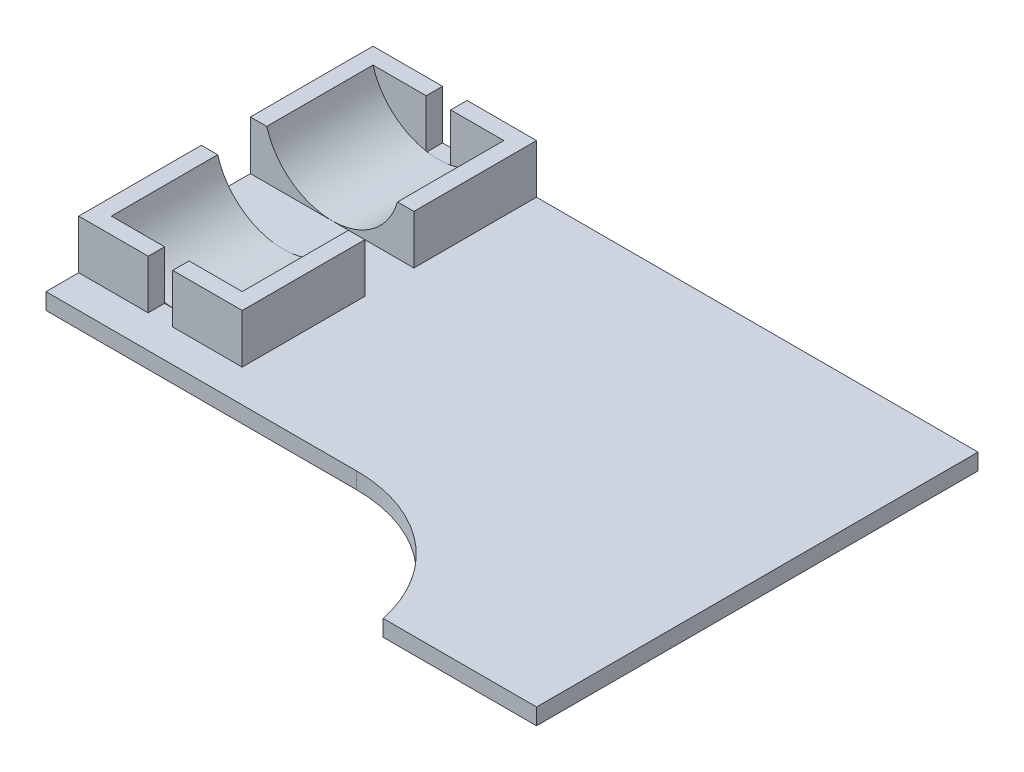
ISO-10303-21;
HEADER;
FILE_DESCRIPTION(('STEP AP214'),'2;1');
FILE_NAME('part.step','',(''),(''),'','','');
FILE_SCHEMA(('AUTOMOTIVE_DESIGN { 1 0 10303 214 1 1 1 1 }'));
ENDSEC;
DATA;
#1=APPLICATION_CONTEXT('core data for automotive mechanical design processes');
#2=APPLICATION_PROTOCOL_DEFINITION('international standard','automotive_design',2000,#1);
#3=PRODUCT_CONTEXT('',#1,'mechanical');
#4=PRODUCT('Part','Part','',(#3));
#5=PRODUCT_RELATED_PRODUCT_CATEGORY('part','',(#4));
#6=PRODUCT_DEFINITION_FORMATION('','',#4);
#7=PRODUCT_DEFINITION_CONTEXT('part definition',#1,'design');
#8=PRODUCT_DEFINITION('design','',#6,#7);
#9=PRODUCT_DEFINITION_SHAPE('','',#8);
#10=(LENGTH_UNIT() NAMED_UNIT(*) SI_UNIT(.MILLI.,.METRE.));
#11=(NAMED_UNIT(*) PLANE_ANGLE_UNIT() SI_UNIT($,.RADIAN.));
#12=(NAMED_UNIT(*) SI_UNIT($,.STERADIAN.) SOLID_ANGLE_UNIT());
#13=UNCERTAINTY_MEASURE_WITH_UNIT(LENGTH_MEASURE(1.E-05),#10,'distance_accuracy_value','');
#14=(GEOMETRIC_REPRESENTATION_CONTEXT(3) GLOBAL_UNCERTAINTY_ASSIGNED_CONTEXT((#13)) GLOBAL_UNIT_ASSIGNED_CONTEXT((#10,
#11,#12)) REPRESENTATION_CONTEXT('',''));
#15=CARTESIAN_POINT('',(0.,0.,0.));
#16=DIRECTION('',(0.,0.,1.));
#17=DIRECTION('',(1.,0.,0.));
#18=AXIS2_PLACEMENT_3D('',#15,#16,#17);
#19=CARTESIAN_POINT('',(-135.,51.6666666666667,85.));
#20=DIRECTION('',(0.,0.,-1.));
#21=DIRECTION('',(-1.,0.,0.));
#22=AXIS2_PLACEMENT_3D('',#19,#20,#21);
#23=CYLINDRICAL_SURFACE('',#22,41.6666666666667);
#24=CARTESIAN_POINT('',(-135.,51.6666666666667,-30.));
#25=DIRECTION('',(0.,0.,1.));
#26=DIRECTION('',(1.,0.,0.));
#27=AXIS2_PLACEMENT_3D('',#24,#25,#26);
#28=CIRCLE('',#27,41.6666666666667);
#29=CARTESIAN_POINT('',(-175.,40.,-30.));
#30=VERTEX_POINT('',#29);
#31=CARTESIAN_POINT('',(-135.,10.,-30.));
#32=VERTEX_POINT('',#31);
#33=EDGE_CURVE('E267',#30,#32,#28,.T.);
#34=ORIENTED_EDGE('',*,*,#33,.F.);
#35=DIRECTION('',(0.,0.,-1.));
#36=VECTOR('',#35,1.);
#37=CARTESIAN_POINT('',(-175.,40.,35.));
#38=LINE('',#37,#36);
#39=CARTESIAN_POINT('',(-175.,40.,35.));
#40=VERTEX_POINT('',#39);
#41=EDGE_CURVE('E359',#40,#30,#38,.T.);
#42=ORIENTED_EDGE('',*,*,#41,.F.);
#43=CARTESIAN_POINT('',(-135.,51.6666666666667,35.));
#44=DIRECTION('',(0.,0.,1.));
#45=DIRECTION('',(1.,0.,0.));
#46=AXIS2_PLACEMENT_3D('',#43,#44,#45);
#47=CIRCLE('',#46,41.6666666666667);
#48=CARTESIAN_POINT('',(-142.5,10.6805579088069,35.));
#49=VERTEX_POINT('',#48);
#50=EDGE_CURVE('E523',#40,#49,#47,.T.);
#51=ORIENTED_EDGE('',*,*,#50,.T.);
#52=CARTESIAN_POINT('',(-135.,10.,35.));
#53=VERTEX_POINT('',#52);
#54=EDGE_CURVE('E520',#49,#53,#47,.T.);
#55=ORIENTED_EDGE('',*,*,#54,.T.);
#56=CARTESIAN_POINT('',(-135.,51.6666666666667,35.));
#57=DIRECTION('',(0.,0.,1.));
#58=DIRECTION('',(1.,0.,0.));
#59=AXIS2_PLACEMENT_3D('',#56,#57,#58);
#60=CIRCLE('',#59,41.6666666666667);
#61=CARTESIAN_POINT('',(-127.5,10.6805579088069,35.));
#62=VERTEX_POINT('',#61);
#63=EDGE_CURVE('E551',#53,#62,#60,.T.);
#64=ORIENTED_EDGE('',*,*,#63,.T.);
#65=CARTESIAN_POINT('',(-95.,40.,35.));
#66=VERTEX_POINT('',#65);
#67=EDGE_CURVE('E545',#62,#66,#60,.T.);
#68=ORIENTED_EDGE('',*,*,#67,.T.);
#69=DIRECTION('',(0.,0.,1.));
#70=VECTOR('',#69,1.);
#71=CARTESIAN_POINT('',(-95.,40.,35.));
#72=LINE('',#71,#70);
#73=CARTESIAN_POINT('',(-95.,40.,-30.));
#74=VERTEX_POINT('',#73);
#75=EDGE_CURVE('E515',#74,#66,#72,.T.);
#76=ORIENTED_EDGE('',*,*,#75,.F.);
#77=EDGE_CURVE('E511',#32,#74,#28,.T.);
#78=ORIENTED_EDGE('',*,*,#77,.F.);
#79=EDGE_LOOP('',(#34,#42,#51,#55,#64,#68,#76,#78));
#80=FACE_BOUND('',#79,.T.);
#81=ADVANCED_FACE('F61',(#80),#23,.F.);
#82=CARTESIAN_POINT('',(5.00000000000003,10.,153.052821927466));
#83=DIRECTION('',(0.,-1.,0.));
#84=DIRECTION('',(0.,0.,-1.));
#85=AXIS2_PLACEMENT_3D('',#82,#83,#84);
#86=PLANE('',#85);
#87=DIRECTION('',(1.,0.,0.));
#88=VECTOR('',#87,1.);
#89=CARTESIAN_POINT('',(0.,10.,-125.));
#90=LINE('',#89,#88);
#91=CARTESIAN_POINT('',(-142.5,10.,-125.));
#92=VERTEX_POINT('',#91);
#93=CARTESIAN_POINT('',(-135.,10.,-125.));
#94=VERTEX_POINT('',#93);
#95=EDGE_CURVE('E532',#92,#94,#90,.T.);
#96=ORIENTED_EDGE('',*,*,#95,.T.);
#97=DIRECTION('',(1.,0.,0.));
#98=VECTOR('',#97,1.);
#99=CARTESIAN_POINT('',(0.,10.,-125.));
#100=LINE('',#99,#98);
#101=CARTESIAN_POINT('',(-127.5,10.,-125.));
#102=VERTEX_POINT('',#101);
#103=EDGE_CURVE('E546',#94,#102,#100,.T.);
#104=ORIENTED_EDGE('',*,*,#103,.T.);
#105=DIRECTION('',(0.,0.,1.));
#106=VECTOR('',#105,1.);
#107=CARTESIAN_POINT('',(-127.5,10.,-135.));
#108=LINE('',#107,#106);
#109=CARTESIAN_POINT('',(-127.5,10.,-135.));
#110=VERTEX_POINT('',#109);
#111=EDGE_CURVE('E294',#110,#102,#108,.T.);
#112=ORIENTED_EDGE('',*,*,#111,.F.);
#113=DIRECTION('',(-1.,0.,0.));
#114=VECTOR('',#113,1.);
#115=CARTESIAN_POINT('',(-185.,10.,-135.));
#116=LINE('',#115,#114);
#117=CARTESIAN_POINT('',(-142.5,10.,-135.));
#118=VERTEX_POINT('',#117);
#119=EDGE_CURVE('E417',#110,#118,#116,.T.);
#120=ORIENTED_EDGE('',*,*,#119,.T.);
#121=DIRECTION('',(0.,0.,-1.));
#122=VECTOR('',#121,1.);
#123=CARTESIAN_POINT('',(-142.5,10.,-135.));
#124=LINE('',#123,#122);
#125=EDGE_CURVE('E314',#92,#118,#124,.T.);
#126=ORIENTED_EDGE('',*,*,#125,.F.);
#127=EDGE_LOOP('',(#96,#104,#112,#120,#126));
#128=FACE_BOUND('',#127,.T.);
#129=ADVANCED_FACE('F639',(#128),#86,.F.);
#130=DIRECTION('',(0.,0.,-1.));
#131=VECTOR('',#130,1.);
#132=CARTESIAN_POINT('',(-85.,10.,-60.));
#133=LINE('',#132,#131);
#134=CARTESIAN_POINT('',(-85.,10.,-60.));
#135=VERTEX_POINT('',#134);
#136=CARTESIAN_POINT('',(-85.,10.,-135.));
#137=VERTEX_POINT('',#136);
#138=EDGE_CURVE('E290',#135,#137,#133,.T.);
#139=ORIENTED_EDGE('',*,*,#138,.F.);
#140=DIRECTION('',(1.,0.,0.));
#141=VECTOR('',#140,1.);
#142=CARTESIAN_POINT('',(-95.,10.,-60.));
#143=LINE('',#142,#141);
#144=CARTESIAN_POINT('',(-135.,10.,-60.));
#145=VERTEX_POINT('',#144);
#146=EDGE_CURVE('E299',#145,#135,#143,.T.);
#147=ORIENTED_EDGE('',*,*,#146,.F.);
#148=DIRECTION('',(1.,0.,0.));
#149=VECTOR('',#148,1.);
#150=CARTESIAN_POINT('',(-175.,10.,-60.));
#151=LINE('',#150,#149);
#152=CARTESIAN_POINT('',(-185.,10.,-60.));
#153=VERTEX_POINT('',#152);
#154=EDGE_CURVE('E320',#153,#145,#151,.T.);
#155=ORIENTED_EDGE('',*,*,#154,.F.);
#156=DIRECTION('',(0.,0.,1.));
#157=VECTOR('',#156,1.);
#158=CARTESIAN_POINT('',(-185.,10.,-135.));
#159=LINE('',#158,#157);
#160=CARTESIAN_POINT('',(-185.,10.,-30.));
#161=VERTEX_POINT('',#160);
#162=EDGE_CURVE('E401',#153,#161,#159,.T.);
#163=ORIENTED_EDGE('',*,*,#162,.T.);
#164=DIRECTION('',(-1.,0.,0.));
#165=VECTOR('',#164,1.);
#166=CARTESIAN_POINT('',(-175.,10.,-30.));
#167=LINE('',#166,#165);
#168=EDGE_CURVE('E354',#32,#161,#167,.T.);
#169=ORIENTED_EDGE('',*,*,#168,.F.);
#170=DIRECTION('',(-1.,0.,0.));
#171=VECTOR('',#170,1.);
#172=CARTESIAN_POINT('',(-95.,10.,-30.));
#173=LINE('',#172,#171);
#174=CARTESIAN_POINT('',(-85.,10.,-30.));
#175=VERTEX_POINT('',#174);
#176=EDGE_CURVE('E597',#175,#32,#173,.T.);
#177=ORIENTED_EDGE('',*,*,#176,.F.);
#178=DIRECTION('',(0.,0.,-1.));
#179=VECTOR('',#178,1.);
#180=CARTESIAN_POINT('',(-85.,10.,45.));
#181=LINE('',#180,#179);
#182=CARTESIAN_POINT('',(-85.,10.,45.));
#183=VERTEX_POINT('',#182);
#184=EDGE_CURVE('E593',#183,#175,#181,.T.);
#185=ORIENTED_EDGE('',*,*,#184,.F.);
#186=DIRECTION('',(1.,0.,0.));
#187=VECTOR('',#186,1.);
#188=CARTESIAN_POINT('',(-127.5,10.,45.));
#189=LINE('',#188,#187);
#190=CARTESIAN_POINT('',(-127.5,10.,45.));
#191=VERTEX_POINT('',#190);
#192=EDGE_CURVE('E569',#191,#183,#189,.T.);
#193=ORIENTED_EDGE('',*,*,#192,.F.);
#194=DIRECTION('',(0.,0.,1.));
#195=VECTOR('',#194,1.);
#196=CARTESIAN_POINT('',(-127.5,10.,45.));
#197=LINE('',#196,#195);
#198=CARTESIAN_POINT('',(-127.5,10.,35.));
#199=VERTEX_POINT('',#198);
#200=EDGE_CURVE('E575',#199,#191,#197,.T.);
#201=ORIENTED_EDGE('',*,*,#200,.F.);
#202=DIRECTION('',(1.,0.,0.));
#203=VECTOR('',#202,1.);
#204=CARTESIAN_POINT('',(0.,10.,35.));
#205=LINE('',#204,#203);
#206=EDGE_CURVE('E556',#53,#199,#205,.T.);
#207=ORIENTED_EDGE('',*,*,#206,.F.);
#208=DIRECTION('',(1.,0.,0.));
#209=VECTOR('',#208,1.);
#210=CARTESIAN_POINT('',(0.,10.,35.));
#211=LINE('',#210,#209);
#212=CARTESIAN_POINT('',(-142.5,10.,35.));
#213=VERTEX_POINT('',#212);
#214=EDGE_CURVE('E526',#213,#53,#211,.T.);
#215=ORIENTED_EDGE('',*,*,#214,.F.);
#216=DIRECTION('',(0.,0.,-1.));
#217=VECTOR('',#216,1.);
#218=CARTESIAN_POINT('',(-142.5,10.,45.));
#219=LINE('',#218,#217);
#220=CARTESIAN_POINT('',(-142.5,10.,45.));
#221=VERTEX_POINT('',#220);
#222=EDGE_CURVE('E360',#221,#213,#219,.T.);
#223=ORIENTED_EDGE('',*,*,#222,.F.);
#224=DIRECTION('',(1.,0.,0.));
#225=VECTOR('',#224,1.);
#226=CARTESIAN_POINT('',(-185.,10.,45.));
#227=LINE('',#226,#225);
#228=CARTESIAN_POINT('',(-185.,10.,45.));
#229=VERTEX_POINT('',#228);
#230=EDGE_CURVE('E380',#229,#221,#227,.T.);
#231=ORIENTED_EDGE('',*,*,#230,.F.);
#232=CARTESIAN_POINT('',(-185.,10.,65.));
#233=VERTEX_POINT('',#232);
#234=EDGE_CURVE('E405',#229,#233,#159,.T.);
#235=ORIENTED_EDGE('',*,*,#234,.T.);
#236=DIRECTION('',(1.,0.,0.));
#237=VECTOR('',#236,1.);
#238=CARTESIAN_POINT('',(-185.,10.,65.));
#239=LINE('',#238,#237);
#240=CARTESIAN_POINT('',(5.00000000000003,10.,65.));
#241=VERTEX_POINT('',#240);
#242=EDGE_CURVE('E404',#233,#241,#239,.T.);
#243=ORIENTED_EDGE('',*,*,#242,.T.);
#244=CARTESIAN_POINT('',(5.00000000000003,10.,153.052821927466));
#245=DIRECTION('',(0.,-1.,0.));
#246=DIRECTION('',(0.,0.,-1.));
#247=AXIS2_PLACEMENT_3D('',#244,#245,#246);
#248=CIRCLE('',#247,88.0528219274657);
#249=CARTESIAN_POINT('',(91.1823361823362,10.,135.));
#250=VERTEX_POINT('',#249);
#251=EDGE_CURVE('E408',#241,#250,#248,.T.);
#252=ORIENTED_EDGE('',*,*,#251,.T.);
#253=DIRECTION('',(1.,0.,0.));
#254=VECTOR('',#253,1.);
#255=CARTESIAN_POINT('',(91.1823361823362,10.,135.));
#256=LINE('',#255,#254);
#257=CARTESIAN_POINT('',(185.,10.,135.));
#258=VERTEX_POINT('',#257);
#259=EDGE_CURVE('E411',#250,#258,#256,.T.);
#260=ORIENTED_EDGE('',*,*,#259,.T.);
#261=DIRECTION('',(0.,0.,-1.));
#262=VECTOR('',#261,1.);
#263=CARTESIAN_POINT('',(185.,10.,-135.));
#264=LINE('',#263,#262);
#265=CARTESIAN_POINT('',(185.,10.,-135.));
#266=VERTEX_POINT('',#265);
#267=EDGE_CURVE('E414',#258,#266,#264,.T.);
#268=ORIENTED_EDGE('',*,*,#267,.T.);
#269=EDGE_CURVE('E418',#266,#137,#116,.T.);
#270=ORIENTED_EDGE('',*,*,#269,.T.);
#271=EDGE_LOOP('',(#139,#147,#155,#163,#169,#177,#185,#193,#201,#207,#215,#223,#231,#235,#243,
#252,#260,#268,#270));
#272=FACE_BOUND('',#271,.T.);
#273=ADVANCED_FACE('F480',(#272),#86,.F.);
#274=CARTESIAN_POINT('',(-185.,10.,-135.));
#275=DIRECTION('',(1.,0.,0.));
#276=DIRECTION('',(0.,0.,-1.));
#277=AXIS2_PLACEMENT_3D('',#274,#275,#276);
#278=PLANE('',#277);
#279=DIRECTION('',(0.,0.,1.));
#280=VECTOR('',#279,1.);
#281=CARTESIAN_POINT('',(-185.,0.,-135.));
#282=LINE('',#281,#280);
#283=CARTESIAN_POINT('',(-185.,0.,-135.));
#284=VERTEX_POINT('',#283);
#285=CARTESIAN_POINT('',(-185.,0.,65.));
#286=VERTEX_POINT('',#285);
#287=EDGE_CURVE('E400',#284,#286,#282,.T.);
#288=ORIENTED_EDGE('',*,*,#287,.T.);
#289=DIRECTION('',(0.,-1.,0.));
#290=VECTOR('',#289,1.);
#291=CARTESIAN_POINT('',(-185.,10.,65.));
#292=LINE('',#291,#290);
#293=EDGE_CURVE('E12',#233,#286,#292,.T.);
#294=ORIENTED_EDGE('',*,*,#293,.F.);
#295=ORIENTED_EDGE('',*,*,#234,.F.);
#296=DIRECTION('',(0.,-1.,0.));
#297=VECTOR('',#296,1.);
#298=CARTESIAN_POINT('',(-185.,40.,45.));
#299=LINE('',#298,#297);
#300=CARTESIAN_POINT('',(-185.,40.,45.));
#301=VERTEX_POINT('',#300);
#302=EDGE_CURVE('E392',#301,#229,#299,.T.);
#303=ORIENTED_EDGE('',*,*,#302,.F.);
#304=DIRECTION('',(0.,0.,1.));
#305=VECTOR('',#304,1.);
#306=CARTESIAN_POINT('',(-185.,40.,45.));
#307=LINE('',#306,#305);
#308=CARTESIAN_POINT('',(-185.,40.,-30.));
#309=VERTEX_POINT('',#308);
#310=EDGE_CURVE('E367',#309,#301,#307,.T.);
#311=ORIENTED_EDGE('',*,*,#310,.F.);
#312=DIRECTION('',(0.,-1.,0.));
#313=VECTOR('',#312,1.);
#314=CARTESIAN_POINT('',(-185.,40.,-30.));
#315=LINE('',#314,#313);
#316=EDGE_CURVE('E396',#309,#161,#315,.T.);
#317=ORIENTED_EDGE('',*,*,#316,.T.);
#318=ORIENTED_EDGE('',*,*,#162,.F.);
#319=DIRECTION('',(0.,-1.,0.));
#320=VECTOR('',#319,1.);
#321=CARTESIAN_POINT('',(-185.,40.,-60.));
#322=LINE('',#321,#320);
#323=CARTESIAN_POINT('',(-185.,40.,-60.));
#324=VERTEX_POINT('',#323);
#325=EDGE_CURVE('E337',#324,#153,#322,.T.);
#326=ORIENTED_EDGE('',*,*,#325,.F.);
#327=DIRECTION('',(0.,0.,1.));
#328=VECTOR('',#327,1.);
#329=CARTESIAN_POINT('',(-185.,40.,-60.));
#330=LINE('',#329,#328);
#331=CARTESIAN_POINT('',(-185.,40.,-135.));
#332=VERTEX_POINT('',#331);
#333=EDGE_CURVE('E330',#332,#324,#330,.T.);
#334=ORIENTED_EDGE('',*,*,#333,.F.);
#335=DIRECTION('',(0.,-1.,0.));
#336=VECTOR('',#335,1.);
#337=CARTESIAN_POINT('',(-185.,10.,-135.));
#338=LINE('',#337,#336);
#339=EDGE_CURVE('E421',#332,#284,#338,.T.);
#340=ORIENTED_EDGE('',*,*,#339,.T.);
#341=EDGE_LOOP('',(#288,#294,#295,#303,#311,#317,#318,#326,#334,#340));
#342=FACE_BOUND('',#341,.T.);
#343=ADVANCED_FACE('F63',(#342),#278,.F.);
#344=CARTESIAN_POINT('',(-185.,10.,65.));
#345=DIRECTION('',(0.,0.,-1.));
#346=DIRECTION('',(-1.,0.,0.));
#347=AXIS2_PLACEMENT_3D('',#344,#345,#346);
#348=PLANE('',#347);
#349=DIRECTION('',(1.,0.,0.));
#350=VECTOR('',#349,1.);
#351=CARTESIAN_POINT('',(-185.,0.,65.));
#352=LINE('',#351,#350);
#353=CARTESIAN_POINT('',(5.00000000000003,0.,65.));
#354=VERTEX_POINT('',#353);
#355=EDGE_CURVE('E425',#286,#354,#352,.T.);
#356=ORIENTED_EDGE('',*,*,#355,.T.);
#357=DIRECTION('',(0.,-1.,0.));
#358=VECTOR('',#357,1.);
#359=CARTESIAN_POINT('',(5.00000000000003,10.,65.));
#360=LINE('',#359,#358);
#361=EDGE_CURVE('E70',#241,#354,#360,.T.);
#362=ORIENTED_EDGE('',*,*,#361,.F.);
#363=ORIENTED_EDGE('',*,*,#242,.F.);
#364=ORIENTED_EDGE('',*,*,#293,.T.);
#365=EDGE_LOOP('',(#356,#362,#363,#364));
#366=FACE_BOUND('',#365,.T.);
#367=ADVANCED_FACE('F483',(#366),#348,.F.);
#368=CARTESIAN_POINT('',(5.00000000000003,10.,153.052821927466));
#369=DIRECTION('',(0.,-1.,0.));
#370=DIRECTION('',(0.,0.,-1.));
#371=AXIS2_PLACEMENT_3D('',#368,#369,#370);
#372=CYLINDRICAL_SURFACE('',#371,88.0528219274657);
#373=CARTESIAN_POINT('',(5.00000000000003,0.,153.052821927466));
#374=DIRECTION('',(0.,-1.,0.));
#375=DIRECTION('',(0.,0.,-1.));
#376=AXIS2_PLACEMENT_3D('',#373,#374,#375);
#377=CIRCLE('',#376,88.0528219274657);
#378=CARTESIAN_POINT('',(91.1823361823362,0.,135.));
#379=VERTEX_POINT('',#378);
#380=EDGE_CURVE('E428',#354,#379,#377,.T.);
#381=ORIENTED_EDGE('',*,*,#380,.T.);
#382=DIRECTION('',(0.,-1.,0.));
#383=VECTOR('',#382,1.);
#384=CARTESIAN_POINT('',(91.1823361823362,10.,135.));
#385=LINE('',#384,#383);
#386=EDGE_CURVE('E451',#250,#379,#385,.T.);
#387=ORIENTED_EDGE('',*,*,#386,.F.);
#388=ORIENTED_EDGE('',*,*,#251,.F.);
#389=ORIENTED_EDGE('',*,*,#361,.T.);
#390=EDGE_LOOP('',(#381,#387,#388,#389));
#391=FACE_BOUND('',#390,.T.);
#392=ADVANCED_FACE('F460',(#391),#372,.F.);
#393=CARTESIAN_POINT('',(91.1823361823362,10.,135.));
#394=DIRECTION('',(0.,0.,-1.));
#395=DIRECTION('',(-1.,0.,0.));
#396=AXIS2_PLACEMENT_3D('',#393,#394,#395);
#397=PLANE('',#396);
#398=DIRECTION('',(1.,0.,0.));
#399=VECTOR('',#398,1.);
#400=CARTESIAN_POINT('',(91.1823361823362,0.,135.));
#401=LINE('',#400,#399);
#402=CARTESIAN_POINT('',(185.,0.,135.));
#403=VERTEX_POINT('',#402);
#404=EDGE_CURVE('E431',#379,#403,#401,.T.);
#405=ORIENTED_EDGE('',*,*,#404,.T.);
#406=DIRECTION('',(0.,-1.,0.));
#407=VECTOR('',#406,1.);
#408=CARTESIAN_POINT('',(185.,10.,135.));
#409=LINE('',#408,#407);
#410=EDGE_CURVE('E447',#258,#403,#409,.T.);
#411=ORIENTED_EDGE('',*,*,#410,.F.);
#412=ORIENTED_EDGE('',*,*,#259,.F.);
#413=ORIENTED_EDGE('',*,*,#386,.T.);
#414=EDGE_LOOP('',(#405,#411,#412,#413));
#415=FACE_BOUND('',#414,.T.);
#416=ADVANCED_FACE('F472',(#415),#397,.F.);
#417=CARTESIAN_POINT('',(185.,10.,-135.));
#418=DIRECTION('',(-1.,0.,0.));
#419=DIRECTION('',(0.,0.,1.));
#420=AXIS2_PLACEMENT_3D('',#417,#418,#419);
#421=PLANE('',#420);
#422=DIRECTION('',(0.,0.,-1.));
#423=VECTOR('',#422,1.);
#424=CARTESIAN_POINT('',(185.,0.,-135.));
#425=LINE('',#424,#423);
#426=CARTESIAN_POINT('',(185.,0.,-135.));
#427=VERTEX_POINT('',#426);
#428=EDGE_CURVE('E434',#403,#427,#425,.T.);
#429=ORIENTED_EDGE('',*,*,#428,.T.);
#430=DIRECTION('',(0.,-1.,0.));
#431=VECTOR('',#430,1.);
#432=CARTESIAN_POINT('',(185.,10.,-135.));
#433=LINE('',#432,#431);
#434=EDGE_CURVE('E443',#266,#427,#433,.T.);
#435=ORIENTED_EDGE('',*,*,#434,.F.);
#436=ORIENTED_EDGE('',*,*,#267,.F.);
#437=ORIENTED_EDGE('',*,*,#410,.T.);
#438=EDGE_LOOP('',(#429,#435,#436,#437));
#439=FACE_BOUND('',#438,.T.);
#440=ADVANCED_FACE('F476',(#439),#421,.F.);
#441=CARTESIAN_POINT('',(-185.,10.,-135.));
#442=DIRECTION('',(0.,0.,1.));
#443=DIRECTION('',(1.,0.,0.));
#444=AXIS2_PLACEMENT_3D('',#441,#442,#443);
#445=PLANE('',#444);
#446=DIRECTION('',(-1.,0.,0.));
#447=VECTOR('',#446,1.);
#448=CARTESIAN_POINT('',(-185.,0.,-135.));
#449=LINE('',#448,#447);
#450=EDGE_CURVE('E437',#427,#284,#449,.T.);
#451=ORIENTED_EDGE('',*,*,#450,.T.);
#452=ORIENTED_EDGE('',*,*,#339,.F.);
#453=DIRECTION('',(-1.,0.,0.));
#454=VECTOR('',#453,1.);
#455=CARTESIAN_POINT('',(-185.,40.,-135.));
#456=LINE('',#455,#454);
#457=CARTESIAN_POINT('',(-142.5,40.,-135.));
#458=VERTEX_POINT('',#457);
#459=EDGE_CURVE('E326',#458,#332,#456,.T.);
#460=ORIENTED_EDGE('',*,*,#459,.F.);
#461=DIRECTION('',(0.,-1.,0.));
#462=VECTOR('',#461,1.);
#463=CARTESIAN_POINT('',(-142.5,40.,-135.));
#464=LINE('',#463,#462);
#465=EDGE_CURVE('E347',#458,#118,#464,.T.);
#466=ORIENTED_EDGE('',*,*,#465,.T.);
#467=ORIENTED_EDGE('',*,*,#119,.F.);
#468=DIRECTION('',(0.,-1.,0.));
#469=VECTOR('',#468,1.);
#470=CARTESIAN_POINT('',(-127.5,40.,-135.));
#471=LINE('',#470,#469);
#472=CARTESIAN_POINT('',(-127.5,40.,-135.));
#473=VERTEX_POINT('',#472);
#474=EDGE_CURVE('E306',#473,#110,#471,.T.);
#475=ORIENTED_EDGE('',*,*,#474,.F.);
#476=DIRECTION('',(-1.,0.,0.));
#477=VECTOR('',#476,1.);
#478=CARTESIAN_POINT('',(-127.5,40.,-135.));
#479=LINE('',#478,#477);
#480=CARTESIAN_POINT('',(-85.,40.,-135.));
#481=VERTEX_POINT('',#480);
#482=EDGE_CURVE('E492',#481,#473,#479,.T.);
#483=ORIENTED_EDGE('',*,*,#482,.F.);
#484=DIRECTION('',(0.,-1.,0.));
#485=VECTOR('',#484,1.);
#486=CARTESIAN_POINT('',(-85.,40.,-135.));
#487=LINE('',#486,#485);
#488=EDGE_CURVE('E310',#481,#137,#487,.T.);
#489=ORIENTED_EDGE('',*,*,#488,.T.);
#490=ORIENTED_EDGE('',*,*,#269,.F.);
#491=ORIENTED_EDGE('',*,*,#434,.T.);
#492=EDGE_LOOP('',(#451,#452,#460,#466,#467,#475,#483,#489,#490,#491));
#493=FACE_BOUND('',#492,.T.);
#494=ADVANCED_FACE('F488',(#493),#445,.F.);
#495=CARTESIAN_POINT('',(5.00000000000003,0.,153.052821927466));
#496=DIRECTION('',(0.,-1.,0.));
#497=DIRECTION('',(0.,0.,-1.));
#498=AXIS2_PLACEMENT_3D('',#495,#496,#497);
#499=PLANE('',#498);
#500=ORIENTED_EDGE('',*,*,#287,.F.);
#501=ORIENTED_EDGE('',*,*,#450,.F.);
#502=ORIENTED_EDGE('',*,*,#428,.F.);
#503=ORIENTED_EDGE('',*,*,#404,.F.);
#504=ORIENTED_EDGE('',*,*,#380,.F.);
#505=ORIENTED_EDGE('',*,*,#355,.F.);
#506=EDGE_LOOP('',(#500,#501,#502,#503,#504,#505));
#507=FACE_BOUND('',#506,.T.);
#508=ADVANCED_FACE('F467',(#507),#499,.T.);
#509=CARTESIAN_POINT('',(-175.,40.,35.));
#510=DIRECTION('',(0.,0.,1.));
#511=DIRECTION('',(1.,0.,0.));
#512=AXIS2_PLACEMENT_3D('',#509,#510,#511);
#513=PLANE('',#512);
#514=DIRECTION('',(0.,-1.,0.));
#515=VECTOR('',#514,1.);
#516=CARTESIAN_POINT('',(-142.5,40.,35.));
#517=LINE('',#516,#515);
#518=CARTESIAN_POINT('',(-142.5,40.,35.));
#519=VERTEX_POINT('',#518);
#520=EDGE_CURVE('E376',#519,#49,#517,.T.);
#521=ORIENTED_EDGE('',*,*,#520,.T.);
#522=ORIENTED_EDGE('',*,*,#50,.F.);
#523=DIRECTION('',(-1.,0.,0.));
#524=VECTOR('',#523,1.);
#525=CARTESIAN_POINT('',(-175.,40.,35.));
#526=LINE('',#525,#524);
#527=EDGE_CURVE('E355',#519,#40,#526,.T.);
#528=ORIENTED_EDGE('',*,*,#527,.F.);
#529=EDGE_LOOP('',(#521,#522,#528));
#530=FACE_BOUND('',#529,.T.);
#531=ADVANCED_FACE('F821',(#530),#513,.F.);
#532=CARTESIAN_POINT('',(-175.,40.,-30.));
#533=DIRECTION('',(0.,0.,1.));
#534=DIRECTION('',(1.,0.,0.));
#535=AXIS2_PLACEMENT_3D('',#532,#533,#534);
#536=PLANE('',#535);
#537=ORIENTED_EDGE('',*,*,#168,.T.);
#538=ORIENTED_EDGE('',*,*,#316,.F.);
#539=DIRECTION('',(-1.,0.,0.));
#540=VECTOR('',#539,1.);
#541=CARTESIAN_POINT('',(-175.,40.,-30.));
#542=LINE('',#541,#540);
#543=EDGE_CURVE('E364',#30,#309,#542,.T.);
#544=ORIENTED_EDGE('',*,*,#543,.F.);
#545=ORIENTED_EDGE('',*,*,#33,.T.);
#546=EDGE_LOOP('',(#537,#538,#544,#545));
#547=FACE_BOUND('',#546,.T.);
#548=ADVANCED_FACE('F505',(#547),#536,.F.);
#549=CARTESIAN_POINT('',(-185.,40.,45.));
#550=DIRECTION('',(0.,0.,-1.));
#551=DIRECTION('',(-1.,0.,0.));
#552=AXIS2_PLACEMENT_3D('',#549,#550,#551);
#553=PLANE('',#552);
#554=ORIENTED_EDGE('',*,*,#230,.T.);
#555=DIRECTION('',(0.,-1.,0.));
#556=VECTOR('',#555,1.);
#557=CARTESIAN_POINT('',(-142.5,40.,45.));
#558=LINE('',#557,#556);
#559=CARTESIAN_POINT('',(-142.5,40.,45.));
#560=VERTEX_POINT('',#559);
#561=EDGE_CURVE('E388',#560,#221,#558,.T.);
#562=ORIENTED_EDGE('',*,*,#561,.F.);
#563=DIRECTION('',(1.,0.,0.));
#564=VECTOR('',#563,1.);
#565=CARTESIAN_POINT('',(-185.,40.,45.));
#566=LINE('',#565,#564);
#567=EDGE_CURVE('E370',#301,#560,#566,.T.);
#568=ORIENTED_EDGE('',*,*,#567,.F.);
#569=ORIENTED_EDGE('',*,*,#302,.T.);
#570=EDGE_LOOP('',(#554,#562,#568,#569));
#571=FACE_BOUND('',#570,.T.);
#572=ADVANCED_FACE('F820',(#571),#553,.F.);
#573=CARTESIAN_POINT('',(-142.5,40.,45.));
#574=DIRECTION('',(-1.,0.,0.));
#575=DIRECTION('',(0.,0.,1.));
#576=AXIS2_PLACEMENT_3D('',#573,#574,#575);
#577=PLANE('',#576);
#578=ORIENTED_EDGE('',*,*,#222,.T.);
#579=DIRECTION('',(0.,1.,0.));
#580=VECTOR('',#579,1.);
#581=CARTESIAN_POINT('',(-142.5,40.,35.));
#582=LINE('',#581,#580);
#583=EDGE_CURVE('E77',#213,#49,#582,.T.);
#584=ORIENTED_EDGE('',*,*,#583,.T.);
#585=ORIENTED_EDGE('',*,*,#520,.F.);
#586=DIRECTION('',(0.,0.,-1.));
#587=VECTOR('',#586,1.);
#588=CARTESIAN_POINT('',(-142.5,40.,45.));
#589=LINE('',#588,#587);
#590=EDGE_CURVE('E373',#560,#519,#589,.T.);
#591=ORIENTED_EDGE('',*,*,#590,.F.);
#592=ORIENTED_EDGE('',*,*,#561,.T.);
#593=EDGE_LOOP('',(#578,#584,#585,#591,#592));
#594=FACE_BOUND('',#593,.T.);
#595=ADVANCED_FACE('F655',(#594),#577,.F.);
#596=CARTESIAN_POINT('',(0.,40.,0.));
#597=DIRECTION('',(0.,1.,0.));
#598=DIRECTION('',(0.,0.,1.));
#599=AXIS2_PLACEMENT_3D('',#596,#597,#598);
#600=PLANE('',#599);
#601=ORIENTED_EDGE('',*,*,#527,.T.);
#602=ORIENTED_EDGE('',*,*,#41,.T.);
#603=ORIENTED_EDGE('',*,*,#543,.T.);
#604=ORIENTED_EDGE('',*,*,#310,.T.);
#605=ORIENTED_EDGE('',*,*,#567,.T.);
#606=ORIENTED_EDGE('',*,*,#590,.T.);
#607=EDGE_LOOP('',(#601,#602,#603,#604,#605,#606));
#608=FACE_BOUND('',#607,.T.);
#609=ADVANCED_FACE('F648',(#608),#600,.T.);
#610=CARTESIAN_POINT('',(-175.,40.,-125.));
#611=DIRECTION('',(0.,0.,-1.));
#612=DIRECTION('',(-1.,0.,0.));
#613=AXIS2_PLACEMENT_3D('',#610,#611,#612);
#614=PLANE('',#613);
#615=DIRECTION('',(1.,0.,0.));
#616=VECTOR('',#615,1.);
#617=CARTESIAN_POINT('',(-175.,40.,-125.));
#618=LINE('',#617,#616);
#619=CARTESIAN_POINT('',(-175.,40.,-125.));
#620=VERTEX_POINT('',#619);
#621=CARTESIAN_POINT('',(-142.5,40.,-125.));
#622=VERTEX_POINT('',#621);
#623=EDGE_CURVE('E319',#620,#622,#618,.T.);
#624=ORIENTED_EDGE('',*,*,#623,.F.);
#625=CARTESIAN_POINT('',(-135.,51.6666666666667,-125.));
#626=DIRECTION('',(0.,0.,1.));
#627=DIRECTION('',(1.,0.,0.));
#628=AXIS2_PLACEMENT_3D('',#625,#626,#627);
#629=CIRCLE('',#628,41.6666666666667);
#630=CARTESIAN_POINT('',(-142.5,10.6805579088069,-125.));
#631=VERTEX_POINT('',#630);
#632=EDGE_CURVE('E85',#620,#631,#629,.T.);
#633=ORIENTED_EDGE('',*,*,#632,.T.);
#634=DIRECTION('',(0.,-1.,0.));
#635=VECTOR('',#634,1.);
#636=CARTESIAN_POINT('',(-142.5,40.,-125.));
#637=LINE('',#636,#635);
#638=EDGE_CURVE('E351',#622,#631,#637,.T.);
#639=ORIENTED_EDGE('',*,*,#638,.F.);
#640=EDGE_LOOP('',(#624,#633,#639));
#641=FACE_BOUND('',#640,.T.);
#642=ADVANCED_FACE('F646',(#641),#614,.F.);
#643=CARTESIAN_POINT('',(-142.5,40.,-135.));
#644=DIRECTION('',(-1.,0.,0.));
#645=DIRECTION('',(0.,0.,1.));
#646=AXIS2_PLACEMENT_3D('',#643,#644,#645);
#647=PLANE('',#646);
#648=ORIENTED_EDGE('',*,*,#125,.T.);
#649=ORIENTED_EDGE('',*,*,#465,.F.);
#650=DIRECTION('',(0.,0.,-1.));
#651=VECTOR('',#650,1.);
#652=CARTESIAN_POINT('',(-142.5,40.,-135.));
#653=LINE('',#652,#651);
#654=EDGE_CURVE('E323',#622,#458,#653,.T.);
#655=ORIENTED_EDGE('',*,*,#654,.F.);
#656=ORIENTED_EDGE('',*,*,#638,.T.);
#657=DIRECTION('',(0.,1.,0.));
#658=VECTOR('',#657,1.);
#659=CARTESIAN_POINT('',(-142.5,40.,-125.));
#660=LINE('',#659,#658);
#661=EDGE_CURVE('E541',#92,#631,#660,.T.);
#662=ORIENTED_EDGE('',*,*,#661,.F.);
#663=EDGE_LOOP('',(#648,#649,#655,#656,#662));
#664=FACE_BOUND('',#663,.T.);
#665=ADVANCED_FACE('F642',(#664),#647,.F.);
#666=CARTESIAN_POINT('',(-175.,40.,-60.));
#667=DIRECTION('',(0.,0.,-1.));
#668=DIRECTION('',(-1.,0.,0.));
#669=AXIS2_PLACEMENT_3D('',#666,#667,#668);
#670=PLANE('',#669);
#671=ORIENTED_EDGE('',*,*,#154,.T.);
#672=CARTESIAN_POINT('',(-135.,51.6666666666667,-60.));
#673=DIRECTION('',(0.,0.,-1.));
#674=DIRECTION('',(-1.,0.,0.));
#675=AXIS2_PLACEMENT_3D('',#672,#673,#674);
#676=CIRCLE('',#675,41.6666666666667);
#677=CARTESIAN_POINT('',(-175.,40.,-60.));
#678=VERTEX_POINT('',#677);
#679=EDGE_CURVE('E262',#145,#678,#676,.T.);
#680=ORIENTED_EDGE('',*,*,#679,.T.);
#681=DIRECTION('',(1.,0.,0.));
#682=VECTOR('',#681,1.);
#683=CARTESIAN_POINT('',(-175.,40.,-60.));
#684=LINE('',#683,#682);
#685=EDGE_CURVE('E333',#324,#678,#684,.T.);
#686=ORIENTED_EDGE('',*,*,#685,.F.);
#687=ORIENTED_EDGE('',*,*,#325,.T.);
#688=EDGE_LOOP('',(#671,#680,#686,#687));
#689=FACE_BOUND('',#688,.T.);
#690=ADVANCED_FACE('F497',(#689),#670,.F.);
#691=CARTESIAN_POINT('',(0.,40.,0.));
#692=DIRECTION('',(0.,-1.,0.));
#693=DIRECTION('',(0.,0.,-1.));
#694=AXIS2_PLACEMENT_3D('',#691,#692,#693);
#695=PLANE('',#694);
#696=DIRECTION('',(0.,0.,-1.));
#697=VECTOR('',#696,1.);
#698=CARTESIAN_POINT('',(-175.,40.,-60.));
#699=LINE('',#698,#697);
#700=EDGE_CURVE('E315',#678,#620,#699,.T.);
#701=ORIENTED_EDGE('',*,*,#700,.T.);
#702=ORIENTED_EDGE('',*,*,#623,.T.);
#703=ORIENTED_EDGE('',*,*,#654,.T.);
#704=ORIENTED_EDGE('',*,*,#459,.T.);
#705=ORIENTED_EDGE('',*,*,#333,.T.);
#706=ORIENTED_EDGE('',*,*,#685,.T.);
#707=EDGE_LOOP('',(#701,#702,#703,#704,#705,#706));
#708=FACE_BOUND('',#707,.T.);
#709=ADVANCED_FACE('F645',(#708),#695,.F.);
#710=CARTESIAN_POINT('',(-85.,40.,-60.));
#711=DIRECTION('',(-1.,0.,0.));
#712=DIRECTION('',(0.,0.,1.));
#713=AXIS2_PLACEMENT_3D('',#710,#711,#712);
#714=PLANE('',#713);
#715=ORIENTED_EDGE('',*,*,#138,.T.);
#716=ORIENTED_EDGE('',*,*,#488,.F.);
#717=DIRECTION('',(0.,0.,-1.));
#718=VECTOR('',#717,1.);
#719=CARTESIAN_POINT('',(-85.,40.,-60.));
#720=LINE('',#719,#718);
#721=CARTESIAN_POINT('',(-85.,40.,-60.));
#722=VERTEX_POINT('',#721);
#723=EDGE_CURVE('E301',#722,#481,#720,.T.);
#724=ORIENTED_EDGE('',*,*,#723,.F.);
#725=DIRECTION('',(0.,-1.,0.));
#726=VECTOR('',#725,1.);
#727=CARTESIAN_POINT('',(-85.,40.,-60.));
#728=LINE('',#727,#726);
#729=EDGE_CURVE('E281',#722,#135,#728,.T.);
#730=ORIENTED_EDGE('',*,*,#729,.T.);
#731=EDGE_LOOP('',(#715,#716,#724,#730));
#732=FACE_BOUND('',#731,.T.);
#733=ADVANCED_FACE('F494',(#732),#714,.F.);
#734=CARTESIAN_POINT('',(-127.5,40.,-135.));
#735=DIRECTION('',(1.,0.,0.));
#736=DIRECTION('',(0.,0.,-1.));
#737=AXIS2_PLACEMENT_3D('',#734,#735,#736);
#738=PLANE('',#737);
#739=ORIENTED_EDGE('',*,*,#111,.T.);
#740=DIRECTION('',(0.,-1.,0.));
#741=VECTOR('',#740,1.);
#742=CARTESIAN_POINT('',(-127.5,40.,-125.));
#743=LINE('',#742,#741);
#744=CARTESIAN_POINT('',(-127.5,10.6805579088069,-125.));
#745=VERTEX_POINT('',#744);
#746=EDGE_CURVE('E566',#745,#102,#743,.T.);
#747=ORIENTED_EDGE('',*,*,#746,.F.);
#748=DIRECTION('',(0.,-1.,0.));
#749=VECTOR('',#748,1.);
#750=CARTESIAN_POINT('',(-127.5,40.,-125.));
#751=LINE('',#750,#749);
#752=CARTESIAN_POINT('',(-127.5,40.,-125.));
#753=VERTEX_POINT('',#752);
#754=EDGE_CURVE('E286',#753,#745,#751,.T.);
#755=ORIENTED_EDGE('',*,*,#754,.F.);
#756=DIRECTION('',(0.,0.,1.));
#757=VECTOR('',#756,1.);
#758=CARTESIAN_POINT('',(-127.5,40.,-135.));
#759=LINE('',#758,#757);
#760=EDGE_CURVE('E621',#473,#753,#759,.T.);
#761=ORIENTED_EDGE('',*,*,#760,.F.);
#762=ORIENTED_EDGE('',*,*,#474,.T.);
#763=EDGE_LOOP('',(#739,#747,#755,#761,#762));
#764=FACE_BOUND('',#763,.T.);
#765=ADVANCED_FACE('F709',(#764),#738,.F.);
#766=CARTESIAN_POINT('',(-127.5,40.,-125.));
#767=DIRECTION('',(0.,0.,-1.));
#768=DIRECTION('',(-1.,0.,0.));
#769=AXIS2_PLACEMENT_3D('',#766,#767,#768);
#770=PLANE('',#769);
#771=ORIENTED_EDGE('',*,*,#754,.T.);
#772=CARTESIAN_POINT('',(-135.,51.6666666666667,-125.));
#773=DIRECTION('',(0.,0.,1.));
#774=DIRECTION('',(1.,0.,0.));
#775=AXIS2_PLACEMENT_3D('',#772,#773,#774);
#776=CIRCLE('',#775,41.6666666666667);
#777=CARTESIAN_POINT('',(-95.,40.,-125.));
#778=VERTEX_POINT('',#777);
#779=EDGE_CURVE('E550',#745,#778,#776,.T.);
#780=ORIENTED_EDGE('',*,*,#779,.T.);
#781=DIRECTION('',(1.,0.,0.));
#782=VECTOR('',#781,1.);
#783=CARTESIAN_POINT('',(-127.5,40.,-125.));
#784=LINE('',#783,#782);
#785=EDGE_CURVE('E276',#753,#778,#784,.T.);
#786=ORIENTED_EDGE('',*,*,#785,.F.);
#787=EDGE_LOOP('',(#771,#780,#786));
#788=FACE_BOUND('',#787,.T.);
#789=ADVANCED_FACE('F706',(#788),#770,.F.);
#790=CARTESIAN_POINT('',(-95.,40.,-60.));
#791=DIRECTION('',(0.,0.,-1.));
#792=DIRECTION('',(-1.,0.,0.));
#793=AXIS2_PLACEMENT_3D('',#790,#791,#792);
#794=PLANE('',#793);
#795=ORIENTED_EDGE('',*,*,#146,.T.);
#796=ORIENTED_EDGE('',*,*,#729,.F.);
#797=DIRECTION('',(1.,0.,0.));
#798=VECTOR('',#797,1.);
#799=CARTESIAN_POINT('',(-95.,40.,-60.));
#800=LINE('',#799,#798);
#801=CARTESIAN_POINT('',(-95.,40.,-60.));
#802=VERTEX_POINT('',#801);
#803=EDGE_CURVE('E273',#802,#722,#800,.T.);
#804=ORIENTED_EDGE('',*,*,#803,.F.);
#805=EDGE_CURVE('E256',#802,#145,#676,.T.);
#806=ORIENTED_EDGE('',*,*,#805,.T.);
#807=EDGE_LOOP('',(#795,#796,#804,#806));
#808=FACE_BOUND('',#807,.T.);
#809=ADVANCED_FACE('F279',(#808),#794,.F.);
#810=CARTESIAN_POINT('',(0.,40.,0.));
#811=DIRECTION('',(0.,-1.,0.));
#812=DIRECTION('',(0.,0.,-1.));
#813=AXIS2_PLACEMENT_3D('',#810,#811,#812);
#814=PLANE('',#813);
#815=ORIENTED_EDGE('',*,*,#723,.T.);
#816=ORIENTED_EDGE('',*,*,#482,.T.);
#817=ORIENTED_EDGE('',*,*,#760,.T.);
#818=ORIENTED_EDGE('',*,*,#785,.T.);
#819=DIRECTION('',(0.,0.,1.));
#820=VECTOR('',#819,1.);
#821=CARTESIAN_POINT('',(-95.,40.,-60.));
#822=LINE('',#821,#820);
#823=EDGE_CURVE('E259',#778,#802,#822,.T.);
#824=ORIENTED_EDGE('',*,*,#823,.T.);
#825=ORIENTED_EDGE('',*,*,#803,.T.);
#826=EDGE_LOOP('',(#815,#816,#817,#818,#824,#825));
#827=FACE_BOUND('',#826,.T.);
#828=ADVANCED_FACE('F272',(#827),#814,.F.);
#829=CARTESIAN_POINT('',(-127.5,40.,45.));
#830=DIRECTION('',(0.,0.,-1.));
#831=DIRECTION('',(-1.,0.,0.));
#832=AXIS2_PLACEMENT_3D('',#829,#830,#831);
#833=PLANE('',#832);
#834=ORIENTED_EDGE('',*,*,#192,.T.);
#835=DIRECTION('',(0.,-1.,0.));
#836=VECTOR('',#835,1.);
#837=CARTESIAN_POINT('',(-85.,40.,45.));
#838=LINE('',#837,#836);
#839=CARTESIAN_POINT('',(-85.,40.,45.));
#840=VERTEX_POINT('',#839);
#841=EDGE_CURVE('E295',#840,#183,#838,.T.);
#842=ORIENTED_EDGE('',*,*,#841,.F.);
#843=DIRECTION('',(1.,0.,0.));
#844=VECTOR('',#843,1.);
#845=CARTESIAN_POINT('',(-127.5,40.,45.));
#846=LINE('',#845,#844);
#847=CARTESIAN_POINT('',(-127.5,40.,45.));
#848=VERTEX_POINT('',#847);
#849=EDGE_CURVE('E570',#848,#840,#846,.T.);
#850=ORIENTED_EDGE('',*,*,#849,.F.);
#851=DIRECTION('',(0.,-1.,0.));
#852=VECTOR('',#851,1.);
#853=CARTESIAN_POINT('',(-127.5,40.,45.));
#854=LINE('',#853,#852);
#855=EDGE_CURVE('E589',#848,#191,#854,.T.);
#856=ORIENTED_EDGE('',*,*,#855,.T.);
#857=EDGE_LOOP('',(#834,#842,#850,#856));
#858=FACE_BOUND('',#857,.T.);
#859=ADVANCED_FACE('F697',(#858),#833,.F.);
#860=CARTESIAN_POINT('',(-85.,40.,45.));
#861=DIRECTION('',(-1.,0.,0.));
#862=DIRECTION('',(0.,0.,1.));
#863=AXIS2_PLACEMENT_3D('',#860,#861,#862);
#864=PLANE('',#863);
#865=ORIENTED_EDGE('',*,*,#184,.T.);
#866=DIRECTION('',(0.,-1.,0.));
#867=VECTOR('',#866,1.);
#868=CARTESIAN_POINT('',(-85.,40.,-30.));
#869=LINE('',#868,#867);
#870=CARTESIAN_POINT('',(-85.,40.,-30.));
#871=VERTEX_POINT('',#870);
#872=EDGE_CURVE('E610',#871,#175,#869,.T.);
#873=ORIENTED_EDGE('',*,*,#872,.F.);
#874=DIRECTION('',(0.,0.,-1.));
#875=VECTOR('',#874,1.);
#876=CARTESIAN_POINT('',(-85.,40.,45.));
#877=LINE('',#876,#875);
#878=EDGE_CURVE('E574',#840,#871,#877,.T.);
#879=ORIENTED_EDGE('',*,*,#878,.F.);
#880=ORIENTED_EDGE('',*,*,#841,.T.);
#881=EDGE_LOOP('',(#865,#873,#879,#880));
#882=FACE_BOUND('',#881,.T.);
#883=ADVANCED_FACE('F694',(#882),#864,.F.);
#884=CARTESIAN_POINT('',(-95.,40.,-30.));
#885=DIRECTION('',(0.,0.,1.));
#886=DIRECTION('',(1.,0.,0.));
#887=AXIS2_PLACEMENT_3D('',#884,#885,#886);
#888=PLANE('',#887);
#889=ORIENTED_EDGE('',*,*,#176,.T.);
#890=ORIENTED_EDGE('',*,*,#77,.T.);
#891=DIRECTION('',(-1.,0.,0.));
#892=VECTOR('',#891,1.);
#893=CARTESIAN_POINT('',(-95.,40.,-30.));
#894=LINE('',#893,#892);
#895=EDGE_CURVE('E578',#871,#74,#894,.T.);
#896=ORIENTED_EDGE('',*,*,#895,.F.);
#897=ORIENTED_EDGE('',*,*,#872,.T.);
#898=EDGE_LOOP('',(#889,#890,#896,#897));
#899=FACE_BOUND('',#898,.T.);
#900=ADVANCED_FACE('F690',(#899),#888,.F.);
#901=CARTESIAN_POINT('',(-127.5,40.,35.));
#902=DIRECTION('',(0.,0.,1.));
#903=DIRECTION('',(1.,0.,0.));
#904=AXIS2_PLACEMENT_3D('',#901,#902,#903);
#905=PLANE('',#904);
#906=DIRECTION('',(-1.,0.,0.));
#907=VECTOR('',#906,1.);
#908=CARTESIAN_POINT('',(-127.5,40.,35.));
#909=LINE('',#908,#907);
#910=CARTESIAN_POINT('',(-127.5,40.,35.));
#911=VERTEX_POINT('',#910);
#912=EDGE_CURVE('E583',#66,#911,#909,.T.);
#913=ORIENTED_EDGE('',*,*,#912,.F.);
#914=ORIENTED_EDGE('',*,*,#67,.F.);
#915=DIRECTION('',(0.,-1.,0.));
#916=VECTOR('',#915,1.);
#917=CARTESIAN_POINT('',(-127.5,40.,35.));
#918=LINE('',#917,#916);
#919=EDGE_CURVE('E606',#911,#62,#918,.T.);
#920=ORIENTED_EDGE('',*,*,#919,.F.);
#921=EDGE_LOOP('',(#913,#914,#920));
#922=FACE_BOUND('',#921,.T.);
#923=ADVANCED_FACE('F686',(#922),#905,.F.);
#924=CARTESIAN_POINT('',(-127.5,40.,45.));
#925=DIRECTION('',(1.,0.,0.));
#926=DIRECTION('',(0.,0.,-1.));
#927=AXIS2_PLACEMENT_3D('',#924,#925,#926);
#928=PLANE('',#927);
#929=ORIENTED_EDGE('',*,*,#200,.T.);
#930=ORIENTED_EDGE('',*,*,#855,.F.);
#931=DIRECTION('',(0.,0.,1.));
#932=VECTOR('',#931,1.);
#933=CARTESIAN_POINT('',(-127.5,40.,45.));
#934=LINE('',#933,#932);
#935=EDGE_CURVE('E586',#911,#848,#934,.T.);
#936=ORIENTED_EDGE('',*,*,#935,.F.);
#937=ORIENTED_EDGE('',*,*,#919,.T.);
#938=DIRECTION('',(0.,-1.,0.));
#939=VECTOR('',#938,1.);
#940=CARTESIAN_POINT('',(-127.5,40.,35.));
#941=LINE('',#940,#939);
#942=EDGE_CURVE('E559',#62,#199,#941,.T.);
#943=ORIENTED_EDGE('',*,*,#942,.T.);
#944=EDGE_LOOP('',(#929,#930,#936,#937,#943));
#945=FACE_BOUND('',#944,.T.);
#946=ADVANCED_FACE('F682',(#945),#928,.F.);
#947=CARTESIAN_POINT('',(0.,40.,0.));
#948=DIRECTION('',(0.,1.,0.));
#949=DIRECTION('',(0.,0.,1.));
#950=AXIS2_PLACEMENT_3D('',#947,#948,#949);
#951=PLANE('',#950);
#952=ORIENTED_EDGE('',*,*,#849,.T.);
#953=ORIENTED_EDGE('',*,*,#878,.T.);
#954=ORIENTED_EDGE('',*,*,#895,.T.);
#955=ORIENTED_EDGE('',*,*,#75,.T.);
#956=ORIENTED_EDGE('',*,*,#912,.T.);
#957=ORIENTED_EDGE('',*,*,#935,.T.);
#958=EDGE_LOOP('',(#952,#953,#954,#955,#956,#957));
#959=FACE_BOUND('',#958,.T.);
#960=ADVANCED_FACE('F678',(#959),#951,.T.);
#961=CARTESIAN_POINT('',(0.,0.,-125.));
#962=DIRECTION('',(0.,0.,1.));
#963=DIRECTION('',(1.,0.,0.));
#964=AXIS2_PLACEMENT_3D('',#961,#962,#963);
#965=PLANE('',#964);
#966=EDGE_CURVE('E552',#94,#745,#776,.T.);
#967=ORIENTED_EDGE('',*,*,#966,.T.);
#968=ORIENTED_EDGE('',*,*,#746,.T.);
#969=ORIENTED_EDGE('',*,*,#103,.F.);
#970=EDGE_LOOP('',(#967,#968,#969));
#971=FACE_BOUND('',#970,.T.);
#972=ADVANCED_FACE('F635',(#971),#965,.F.);
#973=CARTESIAN_POINT('',(-175.,40.,35.));
#974=DIRECTION('',(0.,0.,1.));
#975=DIRECTION('',(1.,0.,0.));
#976=AXIS2_PLACEMENT_3D('',#973,#974,#975);
#977=PLANE('',#976);
#978=ORIENTED_EDGE('',*,*,#942,.F.);
#979=ORIENTED_EDGE('',*,*,#63,.F.);
#980=ORIENTED_EDGE('',*,*,#206,.T.);
#981=EDGE_LOOP('',(#978,#979,#980));
#982=FACE_BOUND('',#981,.T.);
#983=ADVANCED_FACE('F667',(#982),#977,.T.);
#984=ORIENTED_EDGE('',*,*,#805,.F.);
#985=ORIENTED_EDGE('',*,*,#823,.F.);
#986=ORIENTED_EDGE('',*,*,#779,.F.);
#987=ORIENTED_EDGE('',*,*,#966,.F.);
#988=EDGE_CURVE('E535',#631,#94,#629,.T.);
#989=ORIENTED_EDGE('',*,*,#988,.F.);
#990=ORIENTED_EDGE('',*,*,#632,.F.);
#991=ORIENTED_EDGE('',*,*,#700,.F.);
#992=ORIENTED_EDGE('',*,*,#679,.F.);
#993=EDGE_LOOP('',(#984,#985,#986,#987,#989,#990,#991,#992));
#994=FACE_BOUND('',#993,.T.);
#995=ADVANCED_FACE('F258',(#994),#23,.F.);
#996=CARTESIAN_POINT('',(0.,0.,-125.));
#997=DIRECTION('',(0.,0.,1.));
#998=DIRECTION('',(1.,0.,0.));
#999=AXIS2_PLACEMENT_3D('',#996,#997,#998);
#1000=PLANE('',#999);
#1001=ORIENTED_EDGE('',*,*,#95,.F.);
#1002=ORIENTED_EDGE('',*,*,#661,.T.);
#1003=ORIENTED_EDGE('',*,*,#988,.T.);
#1004=EDGE_LOOP('',(#1001,#1002,#1003));
#1005=FACE_BOUND('',#1004,.T.);
#1006=ADVANCED_FACE('F631',(#1005),#1000,.F.);
#1007=CARTESIAN_POINT('',(-175.,40.,35.));
#1008=DIRECTION('',(0.,0.,1.));
#1009=DIRECTION('',(1.,0.,0.));
#1010=AXIS2_PLACEMENT_3D('',#1007,#1008,#1009);
#1011=PLANE('',#1010);
#1012=ORIENTED_EDGE('',*,*,#583,.F.);
#1013=ORIENTED_EDGE('',*,*,#214,.T.);
#1014=ORIENTED_EDGE('',*,*,#54,.F.);
#1015=EDGE_LOOP('',(#1012,#1013,#1014));
#1016=FACE_BOUND('',#1015,.T.);
#1017=ADVANCED_FACE('F672',(#1016),#1011,.T.);
#1018=CLOSED_SHELL('',(#81,#129,#273,#343,#367,#392,#416,#440,#494,#508,#531,#548,#572,#595,
#609,#642,#665,#690,#709,#733,#765,#789,#809,#828,#859,#883,#900,#923,#946,#960,#972,#983,#995,
#1006,#1017));
#1019=MANIFOLD_SOLID_BREP('B2',#1018);
#1020=ADVANCED_BREP_SHAPE_REPRESENTATION('',(#18,#1019),#14);
#1021=SHAPE_DEFINITION_REPRESENTATION(#9,#1020);
ENDSEC;
END-ISO-10303-21;
